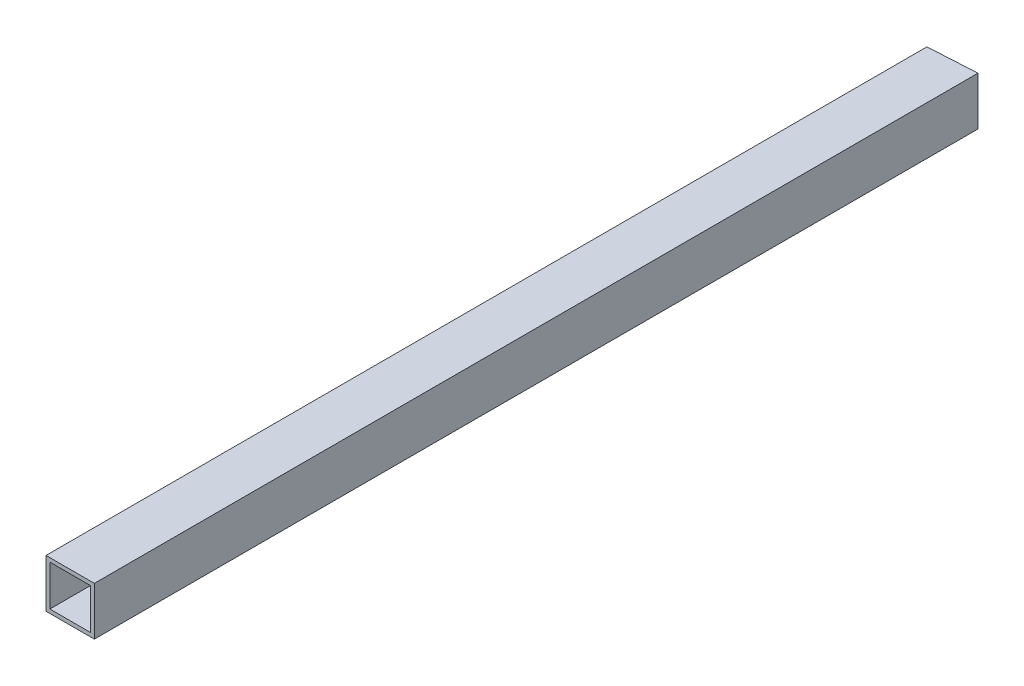
ISO-10303-21;
HEADER;
FILE_DESCRIPTION(('STEP AP214'),'2;1');
FILE_NAME('part.step','',(''),(''),'','','');
FILE_SCHEMA(('AUTOMOTIVE_DESIGN { 1 0 10303 214 1 1 1 1 }'));
ENDSEC;
DATA;
#1=APPLICATION_CONTEXT('core data for automotive mechanical design processes');
#2=APPLICATION_PROTOCOL_DEFINITION('international standard','automotive_design',2000,#1);
#3=PRODUCT_CONTEXT('',#1,'mechanical');
#4=PRODUCT('Part','Part','',(#3));
#5=PRODUCT_RELATED_PRODUCT_CATEGORY('part','',(#4));
#6=PRODUCT_DEFINITION_FORMATION('','',#4);
#7=PRODUCT_DEFINITION_CONTEXT('part definition',#1,'design');
#8=PRODUCT_DEFINITION('design','',#6,#7);
#9=PRODUCT_DEFINITION_SHAPE('','',#8);
#10=(LENGTH_UNIT() NAMED_UNIT(*) SI_UNIT(.MILLI.,.METRE.));
#11=(NAMED_UNIT(*) PLANE_ANGLE_UNIT() SI_UNIT($,.RADIAN.));
#12=(NAMED_UNIT(*) SI_UNIT($,.STERADIAN.) SOLID_ANGLE_UNIT());
#13=UNCERTAINTY_MEASURE_WITH_UNIT(LENGTH_MEASURE(1.E-05),#10,'distance_accuracy_value','');
#14=(GEOMETRIC_REPRESENTATION_CONTEXT(3) GLOBAL_UNCERTAINTY_ASSIGNED_CONTEXT((#13)) GLOBAL_UNIT_ASSIGNED_CONTEXT((#10,
#11,#12)) REPRESENTATION_CONTEXT('',''));
#15=CARTESIAN_POINT('',(0.,0.,0.));
#16=DIRECTION('',(0.,0.,1.));
#17=DIRECTION('',(1.,0.,0.));
#18=AXIS2_PLACEMENT_3D('',#15,#16,#17);
#19=CARTESIAN_POINT('',(-160.,-10.,-825.));
#20=DIRECTION('',(0.,1.,0.));
#21=DIRECTION('',(0.,0.,1.));
#22=AXIS2_PLACEMENT_3D('',#19,#20,#21);
#23=PLANE('',#22);
#24=DIRECTION('',(1.,0.,0.));
#25=VECTOR('',#24,1.);
#26=CARTESIAN_POINT('',(-150.,-10.,-460.));
#27=LINE('',#26,#25);
#28=CARTESIAN_POINT('',(-160.,-10.,-460.));
#29=VERTEX_POINT('',#28);
#30=CARTESIAN_POINT('',(-140.,-10.,-460.));
#31=VERTEX_POINT('',#30);
#32=EDGE_CURVE('E109',#29,#31,#27,.T.);
#33=ORIENTED_EDGE('',*,*,#32,.F.);
#34=DIRECTION('',(0.,0.,1.));
#35=VECTOR('',#34,1.);
#36=CARTESIAN_POINT('',(-160.,-10.,-825.));
#37=LINE('',#36,#35);
#38=CARTESIAN_POINT('',(-160.,-10.,-824.430425230957));
#39=VERTEX_POINT('',#38);
#40=EDGE_CURVE('E118',#39,#29,#37,.T.);
#41=ORIENTED_EDGE('',*,*,#40,.F.);
#42=DIRECTION('',(-0.998381858973911,0.,0.0568653116741472));
#43=VECTOR('',#42,1.);
#44=CARTESIAN_POINT('',(-159.967663363282,-10.,-824.432267044196));
#45=LINE('',#44,#43);
#46=CARTESIAN_POINT('',(-140.,-10.,-825.569574769043));
#47=VERTEX_POINT('',#46);
#48=EDGE_CURVE('E146',#47,#39,#45,.T.);
#49=ORIENTED_EDGE('',*,*,#48,.F.);
#50=DIRECTION('',(0.,0.,1.));
#51=VECTOR('',#50,1.);
#52=CARTESIAN_POINT('',(-140.,-10.,-825.));
#53=LINE('',#52,#51);
#54=EDGE_CURVE('E127',#47,#31,#53,.T.);
#55=ORIENTED_EDGE('',*,*,#54,.T.);
#56=EDGE_LOOP('',(#33,#41,#49,#55));
#57=FACE_BOUND('',#56,.T.);
#58=ADVANCED_FACE('F41',(#57),#23,.F.);
#59=CARTESIAN_POINT('',(-160.,-10.,-825.));
#60=DIRECTION('',(1.,0.,0.));
#61=DIRECTION('',(0.,0.,-1.));
#62=AXIS2_PLACEMENT_3D('',#59,#60,#61);
#63=PLANE('',#62);
#64=DIRECTION('',(0.,1.,0.));
#65=VECTOR('',#64,1.);
#66=CARTESIAN_POINT('',(-159.999999999999,-10.,-459.999999999999));
#67=LINE('',#66,#65);
#68=CARTESIAN_POINT('',(-159.999999999999,10.,-459.999999999999));
#69=VERTEX_POINT('',#68);
#70=EDGE_CURVE('E55',#29,#69,#67,.T.);
#71=ORIENTED_EDGE('',*,*,#70,.T.);
#72=DIRECTION('',(0.,0.,1.));
#73=VECTOR('',#72,1.);
#74=CARTESIAN_POINT('',(-160.,10.,-825.));
#75=LINE('',#74,#73);
#76=CARTESIAN_POINT('',(-160.,10.,-824.430425230957));
#77=VERTEX_POINT('',#76);
#78=EDGE_CURVE('E115',#77,#69,#75,.T.);
#79=ORIENTED_EDGE('',*,*,#78,.F.);
#80=DIRECTION('',(0.,1.,0.));
#81=VECTOR('',#80,1.);
#82=CARTESIAN_POINT('',(-160.,-10.,-824.430425230957));
#83=LINE('',#82,#81);
#84=EDGE_CURVE('E150',#39,#77,#83,.T.);
#85=ORIENTED_EDGE('',*,*,#84,.F.);
#86=ORIENTED_EDGE('',*,*,#40,.T.);
#87=EDGE_LOOP('',(#71,#79,#85,#86));
#88=FACE_BOUND('',#87,.T.);
#89=ADVANCED_FACE('F114',(#88),#63,.F.);
#90=CARTESIAN_POINT('',(-160.,10.,-825.));
#91=DIRECTION('',(0.,-1.,0.));
#92=DIRECTION('',(0.,0.,-1.));
#93=AXIS2_PLACEMENT_3D('',#90,#91,#92);
#94=PLANE('',#93);
#95=DIRECTION('',(1.,0.,0.));
#96=VECTOR('',#95,1.);
#97=CARTESIAN_POINT('',(-150.,10.,-460.));
#98=LINE('',#97,#96);
#99=CARTESIAN_POINT('',(-140.,10.,-460.));
#100=VERTEX_POINT('',#99);
#101=EDGE_CURVE('E102',#69,#100,#98,.T.);
#102=ORIENTED_EDGE('',*,*,#101,.T.);
#103=DIRECTION('',(0.,0.,1.));
#104=VECTOR('',#103,1.);
#105=CARTESIAN_POINT('',(-140.,10.,-825.));
#106=LINE('',#105,#104);
#107=CARTESIAN_POINT('',(-140.,10.,-825.569574769043));
#108=VERTEX_POINT('',#107);
#109=EDGE_CURVE('E123',#108,#100,#106,.T.);
#110=ORIENTED_EDGE('',*,*,#109,.F.);
#111=DIRECTION('',(0.998381858973911,0.,-0.0568653116741472));
#112=VECTOR('',#111,1.);
#113=CARTESIAN_POINT('',(-159.967663363282,10.,-824.432267044196));
#114=LINE('',#113,#112);
#115=EDGE_CURVE('E122',#77,#108,#114,.T.);
#116=ORIENTED_EDGE('',*,*,#115,.F.);
#117=ORIENTED_EDGE('',*,*,#78,.T.);
#118=EDGE_LOOP('',(#102,#110,#116,#117));
#119=FACE_BOUND('',#118,.T.);
#120=ADVANCED_FACE('F120',(#119),#94,.F.);
#121=CARTESIAN_POINT('',(-140.,-10.,-825.));
#122=DIRECTION('',(-1.,0.,0.));
#123=DIRECTION('',(0.,0.,1.));
#124=AXIS2_PLACEMENT_3D('',#121,#122,#123);
#125=PLANE('',#124);
#126=DIRECTION('',(0.,1.,0.));
#127=VECTOR('',#126,1.);
#128=CARTESIAN_POINT('',(-140.,-10.,-460.));
#129=LINE('',#128,#127);
#130=EDGE_CURVE('E105',#31,#100,#129,.T.);
#131=ORIENTED_EDGE('',*,*,#130,.F.);
#132=ORIENTED_EDGE('',*,*,#54,.F.);
#133=DIRECTION('',(0.,-1.,0.));
#134=VECTOR('',#133,1.);
#135=CARTESIAN_POINT('',(-140.,-10.,-825.569574769043));
#136=LINE('',#135,#134);
#137=EDGE_CURVE('E180',#108,#47,#136,.T.);
#138=ORIENTED_EDGE('',*,*,#137,.F.);
#139=ORIENTED_EDGE('',*,*,#109,.T.);
#140=EDGE_LOOP('',(#131,#132,#138,#139));
#141=FACE_BOUND('',#140,.T.);
#142=ADVANCED_FACE('F185',(#141),#125,.F.);
#143=CARTESIAN_POINT('',(-150.,0.,-825.));
#144=DIRECTION('',(-0.0568653116741472,0.,-0.998381858973911));
#145=DIRECTION('',(-0.998381858973911,0.,0.0568653116741472));
#146=AXIS2_PLACEMENT_3D('',#143,#144,#145);
#147=PLANE('',#146);
#148=DIRECTION('',(0.,-1.,0.));
#149=VECTOR('',#148,1.);
#150=CARTESIAN_POINT('',(-141.6,-8.40000000000002,-825.478442805996));
#151=LINE('',#150,#149);
#152=CARTESIAN_POINT('',(-141.6,8.39999999999999,-825.478442805996));
#153=VERTEX_POINT('',#152);
#154=CARTESIAN_POINT('',(-141.6,-8.40000000000002,-825.478442805996));
#155=VERTEX_POINT('',#154);
#156=EDGE_CURVE('E177',#153,#155,#151,.T.);
#157=ORIENTED_EDGE('',*,*,#156,.F.);
#158=DIRECTION('',(0.998381858973911,0.,-0.0568653116741472));
#159=VECTOR('',#158,1.);
#160=CARTESIAN_POINT('',(-158.372837225157,8.39999999999999,-824.523104317125));
#161=LINE('',#160,#159);
#162=CARTESIAN_POINT('',(-158.4,8.39999999999999,-824.521557194004));
#163=VERTEX_POINT('',#162);
#164=EDGE_CURVE('E175',#163,#153,#161,.T.);
#165=ORIENTED_EDGE('',*,*,#164,.F.);
#166=DIRECTION('',(0.,1.,0.));
#167=VECTOR('',#166,1.);
#168=CARTESIAN_POINT('',(-158.4,-8.39999999999999,-824.521557194004));
#169=LINE('',#168,#167);
#170=CARTESIAN_POINT('',(-158.4,-8.39999999999999,-824.521557194004));
#171=VERTEX_POINT('',#170);
#172=EDGE_CURVE('E166',#171,#163,#169,.T.);
#173=ORIENTED_EDGE('',*,*,#172,.F.);
#174=DIRECTION('',(-0.998381858973911,0.,0.0568653116741472));
#175=VECTOR('',#174,1.);
#176=CARTESIAN_POINT('',(-158.372837225157,-8.39999999999999,-824.523104317125));
#177=LINE('',#176,#175);
#178=EDGE_CURVE('E48',#155,#171,#177,.T.);
#179=ORIENTED_EDGE('',*,*,#178,.F.);
#180=EDGE_LOOP('',(#157,#165,#173,#179));
#181=FACE_BOUND('',#180,.T.);
#182=ORIENTED_EDGE('',*,*,#137,.T.);
#183=ORIENTED_EDGE('',*,*,#48,.T.);
#184=ORIENTED_EDGE('',*,*,#84,.T.);
#185=ORIENTED_EDGE('',*,*,#115,.T.);
#186=EDGE_LOOP('',(#182,#183,#184,#185));
#187=FACE_BOUND('',#186,.T.);
#188=ADVANCED_FACE('F181',(#181,#187),#147,.T.);
#189=CARTESIAN_POINT('',(-141.6,-8.40000000000002,-825.));
#190=DIRECTION('',(-1.,0.,0.));
#191=DIRECTION('',(0.,0.,1.));
#192=AXIS2_PLACEMENT_3D('',#189,#190,#191);
#193=PLANE('',#192);
#194=DIRECTION('',(0.,0.,1.));
#195=VECTOR('',#194,1.);
#196=CARTESIAN_POINT('',(-141.6,-8.40000000000002,-825.));
#197=LINE('',#196,#195);
#198=CARTESIAN_POINT('',(-141.6,-8.40000000000002,-460.));
#199=VERTEX_POINT('',#198);
#200=EDGE_CURVE('E125',#155,#199,#197,.T.);
#201=ORIENTED_EDGE('',*,*,#200,.T.);
#202=DIRECTION('',(0.,1.,0.));
#203=VECTOR('',#202,1.);
#204=CARTESIAN_POINT('',(-141.6,-8.40000000000002,-460.));
#205=LINE('',#204,#203);
#206=CARTESIAN_POINT('',(-141.6,8.39999999999999,-460.));
#207=VERTEX_POINT('',#206);
#208=EDGE_CURVE('E11',#199,#207,#205,.T.);
#209=ORIENTED_EDGE('',*,*,#208,.T.);
#210=DIRECTION('',(0.,0.,1.));
#211=VECTOR('',#210,1.);
#212=CARTESIAN_POINT('',(-141.6,8.39999999999999,-825.));
#213=LINE('',#212,#211);
#214=EDGE_CURVE('E131',#153,#207,#213,.T.);
#215=ORIENTED_EDGE('',*,*,#214,.F.);
#216=ORIENTED_EDGE('',*,*,#156,.T.);
#217=EDGE_LOOP('',(#201,#209,#215,#216));
#218=FACE_BOUND('',#217,.T.);
#219=ADVANCED_FACE('F193',(#218),#193,.T.);
#220=CARTESIAN_POINT('',(-158.4,8.39999999999999,-825.));
#221=DIRECTION('',(0.,-1.,0.));
#222=DIRECTION('',(0.,0.,-1.));
#223=AXIS2_PLACEMENT_3D('',#220,#221,#222);
#224=PLANE('',#223);
#225=ORIENTED_EDGE('',*,*,#214,.T.);
#226=DIRECTION('',(-1.,0.,0.));
#227=VECTOR('',#226,1.);
#228=CARTESIAN_POINT('',(-158.4,8.39999999999999,-460.));
#229=LINE('',#228,#227);
#230=CARTESIAN_POINT('',(-158.4,8.39999999999999,-460.));
#231=VERTEX_POINT('',#230);
#232=EDGE_CURVE('E63',#207,#231,#229,.T.);
#233=ORIENTED_EDGE('',*,*,#232,.T.);
#234=DIRECTION('',(0.,0.,1.));
#235=VECTOR('',#234,1.);
#236=CARTESIAN_POINT('',(-158.4,8.39999999999999,-825.));
#237=LINE('',#236,#235);
#238=EDGE_CURVE('E136',#163,#231,#237,.T.);
#239=ORIENTED_EDGE('',*,*,#238,.F.);
#240=ORIENTED_EDGE('',*,*,#164,.T.);
#241=EDGE_LOOP('',(#225,#233,#239,#240));
#242=FACE_BOUND('',#241,.T.);
#243=ADVANCED_FACE('F226',(#242),#224,.T.);
#244=CARTESIAN_POINT('',(-158.4,-8.39999999999999,-825.));
#245=DIRECTION('',(1.,0.,0.));
#246=DIRECTION('',(0.,0.,-1.));
#247=AXIS2_PLACEMENT_3D('',#244,#245,#246);
#248=PLANE('',#247);
#249=ORIENTED_EDGE('',*,*,#238,.T.);
#250=DIRECTION('',(0.,-1.,0.));
#251=VECTOR('',#250,1.);
#252=CARTESIAN_POINT('',(-158.4,-8.39999999999999,-460.));
#253=LINE('',#252,#251);
#254=CARTESIAN_POINT('',(-158.4,-8.39999999999999,-460.));
#255=VERTEX_POINT('',#254);
#256=EDGE_CURVE('E167',#231,#255,#253,.T.);
#257=ORIENTED_EDGE('',*,*,#256,.T.);
#258=DIRECTION('',(0.,0.,1.));
#259=VECTOR('',#258,1.);
#260=CARTESIAN_POINT('',(-158.4,-8.39999999999999,-825.));
#261=LINE('',#260,#259);
#262=EDGE_CURVE('E142',#171,#255,#261,.T.);
#263=ORIENTED_EDGE('',*,*,#262,.F.);
#264=ORIENTED_EDGE('',*,*,#172,.T.);
#265=EDGE_LOOP('',(#249,#257,#263,#264));
#266=FACE_BOUND('',#265,.T.);
#267=ADVANCED_FACE('F165',(#266),#248,.T.);
#268=CARTESIAN_POINT('',(-158.4,-8.39999999999999,-825.));
#269=DIRECTION('',(0.,1.,0.));
#270=DIRECTION('',(-1.,0.,0.));
#271=AXIS2_PLACEMENT_3D('',#268,#269,#270);
#272=PLANE('',#271);
#273=ORIENTED_EDGE('',*,*,#262,.T.);
#274=DIRECTION('',(1.,0.,0.));
#275=VECTOR('',#274,1.);
#276=CARTESIAN_POINT('',(-158.4,-8.39999999999999,-460.));
#277=LINE('',#276,#275);
#278=EDGE_CURVE('E161',#255,#199,#277,.T.);
#279=ORIENTED_EDGE('',*,*,#278,.T.);
#280=ORIENTED_EDGE('',*,*,#200,.F.);
#281=ORIENTED_EDGE('',*,*,#178,.T.);
#282=EDGE_LOOP('',(#273,#279,#280,#281));
#283=FACE_BOUND('',#282,.T.);
#284=ADVANCED_FACE('F160',(#283),#272,.T.);
#285=CARTESIAN_POINT('',(-150.,-10.,-460.));
#286=DIRECTION('',(0.,0.,1.));
#287=DIRECTION('',(1.,0.,0.));
#288=AXIS2_PLACEMENT_3D('',#285,#286,#287);
#289=PLANE('',#288);
#290=ORIENTED_EDGE('',*,*,#256,.F.);
#291=ORIENTED_EDGE('',*,*,#232,.F.);
#292=ORIENTED_EDGE('',*,*,#208,.F.);
#293=ORIENTED_EDGE('',*,*,#278,.F.);
#294=EDGE_LOOP('',(#290,#291,#292,#293));
#295=FACE_BOUND('',#294,.T.);
#296=ORIENTED_EDGE('',*,*,#130,.T.);
#297=ORIENTED_EDGE('',*,*,#101,.F.);
#298=ORIENTED_EDGE('',*,*,#70,.F.);
#299=ORIENTED_EDGE('',*,*,#32,.T.);
#300=EDGE_LOOP('',(#296,#297,#298,#299));
#301=FACE_BOUND('',#300,.T.);
#302=ADVANCED_FACE('F103',(#295,#301),#289,.T.);
#303=CLOSED_SHELL('',(#58,#89,#120,#142,#188,#219,#243,#267,#284,#302));
#304=MANIFOLD_SOLID_BREP('B2',#303);
#305=ADVANCED_BREP_SHAPE_REPRESENTATION('',(#18,#304),#14);
#306=SHAPE_DEFINITION_REPRESENTATION(#9,#305);
ENDSEC;
END-ISO-10303-21;
